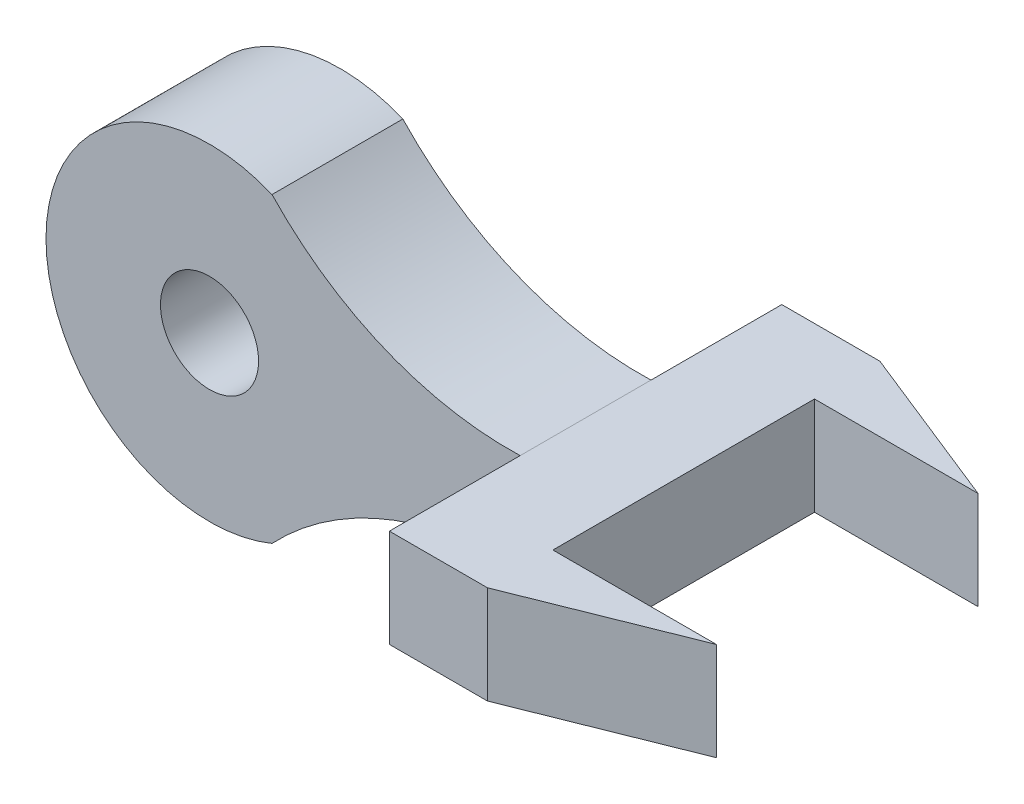
ISO-10303-21;
HEADER;
FILE_DESCRIPTION(('STEP AP214'),'2;1');
FILE_NAME('part.step','',(''),(''),'','','');
FILE_SCHEMA(('AUTOMOTIVE_DESIGN { 1 0 10303 214 1 1 1 1 }'));
ENDSEC;
DATA;
#1=APPLICATION_CONTEXT('core data for automotive mechanical design processes');
#2=APPLICATION_PROTOCOL_DEFINITION('international standard','automotive_design',2000,#1);
#3=PRODUCT_CONTEXT('',#1,'mechanical');
#4=PRODUCT('Part','Part','',(#3));
#5=PRODUCT_RELATED_PRODUCT_CATEGORY('part','',(#4));
#6=PRODUCT_DEFINITION_FORMATION('','',#4);
#7=PRODUCT_DEFINITION_CONTEXT('part definition',#1,'design');
#8=PRODUCT_DEFINITION('design','',#6,#7);
#9=PRODUCT_DEFINITION_SHAPE('','',#8);
#10=(LENGTH_UNIT() NAMED_UNIT(*) SI_UNIT(.MILLI.,.METRE.));
#11=(NAMED_UNIT(*) PLANE_ANGLE_UNIT() SI_UNIT($,.RADIAN.));
#12=(NAMED_UNIT(*) SI_UNIT($,.STERADIAN.) SOLID_ANGLE_UNIT());
#13=UNCERTAINTY_MEASURE_WITH_UNIT(LENGTH_MEASURE(1.E-05),#10,'distance_accuracy_value','');
#14=(GEOMETRIC_REPRESENTATION_CONTEXT(3) GLOBAL_UNCERTAINTY_ASSIGNED_CONTEXT((#13)) GLOBAL_UNIT_ASSIGNED_CONTEXT((#10,
#11,#12)) REPRESENTATION_CONTEXT('',''));
#15=CARTESIAN_POINT('',(0.,0.,0.));
#16=DIRECTION('',(0.,0.,1.));
#17=DIRECTION('',(1.,0.,0.));
#18=AXIS2_PLACEMENT_3D('',#15,#16,#17);
#19=CARTESIAN_POINT('',(91.7262942344475,-114.960943200018,20.));
#20=DIRECTION('',(0.,0.,-1.));
#21=DIRECTION('',(-1.,0.,0.));
#22=AXIS2_PLACEMENT_3D('',#19,#20,#21);
#23=PLANE('',#22);
#24=CARTESIAN_POINT('',(-2.22044604925031E-13,0.,20.));
#25=DIRECTION('',(0.,0.,1.));
#26=DIRECTION('',(1.,0.,0.));
#27=AXIS2_PLACEMENT_3D('',#24,#25,#26);
#28=CIRCLE('',#27,15.);
#29=CARTESIAN_POINT('',(14.9999999999998,0.,20.));
#30=VERTEX_POINT('',#29);
#31=EDGE_CURVE('E204',#30,#30,#28,.T.);
#32=ORIENTED_EDGE('',*,*,#31,.F.);
#33=EDGE_LOOP('',(#32));
#34=FACE_BOUND('',#33,.T.);
#35=DIRECTION('',(0.,-1.,0.));
#36=VECTOR('',#35,1.);
#37=CARTESIAN_POINT('',(94.9999999999995,-114.960943200018,20.));
#38=LINE('',#37,#36);
#39=CARTESIAN_POINT('',(95.,15.,20.));
#40=VERTEX_POINT('',#39);
#41=CARTESIAN_POINT('',(94.9999999999997,-15.,20.0000000000002));
#42=VERTEX_POINT('',#41);
#43=EDGE_CURVE('E201',#40,#42,#38,.T.);
#44=ORIENTED_EDGE('',*,*,#43,.F.);
#45=CARTESIAN_POINT('',(91.7396505637635,114.946836475967,20.0000000000002));
#46=DIRECTION('',(0.,0.,-1.));
#47=DIRECTION('',(1.,0.,0.));
#48=AXIS2_PLACEMENT_3D('',#45,#46,#47);
#49=CIRCLE('',#48,100.);
#50=CARTESIAN_POINT('',(19.1173128101043,46.2009561688995,20.0000000000002));
#51=VERTEX_POINT('',#50);
#52=EDGE_CURVE('E210',#40,#51,#49,.T.);
#53=ORIENTED_EDGE('',*,*,#52,.T.);
#54=CARTESIAN_POINT('',(-2.22044604925031E-13,0.,20.));
#55=DIRECTION('',(0.,0.,1.));
#56=DIRECTION('',(1.,0.,0.));
#57=AXIS2_PLACEMENT_3D('',#54,#55,#56);
#58=CIRCLE('',#57,50.);
#59=CARTESIAN_POINT('',(19.1173128101054,-46.2009561688994,20.));
#60=VERTEX_POINT('',#59);
#61=EDGE_CURVE('E212',#51,#60,#58,.T.);
#62=ORIENTED_EDGE('',*,*,#61,.T.);
#63=CARTESIAN_POINT('',(91.7262942344475,-114.960943200018,20.));
#64=DIRECTION('',(0.,0.,-1.));
#65=DIRECTION('',(-1.,0.,0.));
#66=AXIS2_PLACEMENT_3D('',#63,#64,#65);
#67=CIRCLE('',#66,100.);
#68=CARTESIAN_POINT('',(94.5209023577478,-14.9999999999999,20.));
#69=VERTEX_POINT('',#68);
#70=EDGE_CURVE('E215',#60,#69,#67,.T.);
#71=ORIENTED_EDGE('',*,*,#70,.T.);
#72=DIRECTION('',(1.,0.,0.));
#73=VECTOR('',#72,1.);
#74=CARTESIAN_POINT('',(94.5209023577478,-14.9999999999999,20.));
#75=LINE('',#74,#73);
#76=EDGE_CURVE('E57',#69,#42,#75,.T.);
#77=ORIENTED_EDGE('',*,*,#76,.T.);
#78=EDGE_LOOP('',(#44,#53,#62,#71,#77));
#79=FACE_BOUND('',#78,.T.);
#80=ADVANCED_FACE('F36',(#34,#79),#23,.F.);
#81=CARTESIAN_POINT('',(91.7262942344479,-114.960943200018,-20.));
#82=DIRECTION('',(0.,0.,-1.));
#83=DIRECTION('',(-1.,0.,0.));
#84=AXIS2_PLACEMENT_3D('',#81,#82,#83);
#85=PLANE('',#84);
#86=CARTESIAN_POINT('',(0.,0.,-19.9999999999999));
#87=DIRECTION('',(0.,0.,1.));
#88=DIRECTION('',(1.,0.,0.));
#89=AXIS2_PLACEMENT_3D('',#86,#87,#88);
#90=CIRCLE('',#89,15.);
#91=CARTESIAN_POINT('',(15.,0.,-19.9999999999999));
#92=VERTEX_POINT('',#91);
#93=EDGE_CURVE('E203',#92,#92,#90,.T.);
#94=ORIENTED_EDGE('',*,*,#93,.T.);
#95=EDGE_LOOP('',(#94));
#96=FACE_BOUND('',#95,.T.);
#97=CARTESIAN_POINT('',(91.739650563764,114.946836475967,-20.));
#98=DIRECTION('',(0.,0.,-1.));
#99=DIRECTION('',(1.,0.,0.));
#100=AXIS2_PLACEMENT_3D('',#97,#98,#99);
#101=CIRCLE('',#100,100.);
#102=CARTESIAN_POINT('',(94.9999999999997,15.,-20.));
#103=VERTEX_POINT('',#102);
#104=CARTESIAN_POINT('',(19.1173128101054,46.2009561688996,-20.));
#105=VERTEX_POINT('',#104);
#106=EDGE_CURVE('E207',#103,#105,#101,.T.);
#107=ORIENTED_EDGE('',*,*,#106,.F.);
#108=DIRECTION('',(0.,-1.,0.));
#109=VECTOR('',#108,1.);
#110=CARTESIAN_POINT('',(95.,-114.960943200018,-19.9999999999999));
#111=LINE('',#110,#109);
#112=CARTESIAN_POINT('',(95.,-15.,-19.9999999999999));
#113=VERTEX_POINT('',#112);
#114=EDGE_CURVE('E198',#103,#113,#111,.T.);
#115=ORIENTED_EDGE('',*,*,#114,.T.);
#116=DIRECTION('',(1.,0.,0.));
#117=VECTOR('',#116,1.);
#118=CARTESIAN_POINT('',(94.5209023577478,-14.9999999999999,-20.));
#119=LINE('',#118,#117);
#120=CARTESIAN_POINT('',(94.5209023577478,-14.9999999999999,-20.));
#121=VERTEX_POINT('',#120);
#122=EDGE_CURVE('E213',#121,#113,#119,.T.);
#123=ORIENTED_EDGE('',*,*,#122,.F.);
#124=CARTESIAN_POINT('',(91.7262942344479,-114.960943200018,-20.));
#125=DIRECTION('',(0.,0.,-1.));
#126=DIRECTION('',(-1.,0.,0.));
#127=AXIS2_PLACEMENT_3D('',#124,#125,#126);
#128=CIRCLE('',#127,100.);
#129=CARTESIAN_POINT('',(19.1173128101056,-46.2009561688995,-20.));
#130=VERTEX_POINT('',#129);
#131=EDGE_CURVE('E222',#130,#121,#128,.T.);
#132=ORIENTED_EDGE('',*,*,#131,.F.);
#133=CARTESIAN_POINT('',(0.,0.,-19.9999999999999));
#134=DIRECTION('',(0.,0.,1.));
#135=DIRECTION('',(1.,0.,0.));
#136=AXIS2_PLACEMENT_3D('',#133,#134,#135);
#137=CIRCLE('',#136,50.);
#138=EDGE_CURVE('E220',#105,#130,#137,.T.);
#139=ORIENTED_EDGE('',*,*,#138,.F.);
#140=EDGE_LOOP('',(#107,#115,#123,#132,#139));
#141=FACE_BOUND('',#140,.T.);
#142=ADVANCED_FACE('F245',(#96,#141),#85,.T.);
#143=CARTESIAN_POINT('',(125.,15.0000000000001,20.));
#144=DIRECTION('',(-1.,0.,0.));
#145=DIRECTION('',(0.,0.,1.));
#146=AXIS2_PLACEMENT_3D('',#143,#144,#145);
#147=PLANE('',#146);
#148=DIRECTION('',(0.,0.,-1.));
#149=VECTOR('',#148,1.);
#150=CARTESIAN_POINT('',(125.,15.0000000000001,20.));
#151=LINE('',#150,#149);
#152=CARTESIAN_POINT('',(125.,15.,40.0000000000002));
#153=VERTEX_POINT('',#152);
#154=CARTESIAN_POINT('',(125.,15.0000000000001,-40.));
#155=VERTEX_POINT('',#154);
#156=EDGE_CURVE('E11',#153,#155,#151,.T.);
#157=ORIENTED_EDGE('',*,*,#156,.F.);
#158=DIRECTION('',(0.,1.,0.));
#159=VECTOR('',#158,1.);
#160=CARTESIAN_POINT('',(125.,-68.8516480713451,40.0000000000002));
#161=LINE('',#160,#159);
#162=CARTESIAN_POINT('',(125.,-15.,40.));
#163=VERTEX_POINT('',#162);
#164=EDGE_CURVE('E140',#163,#153,#161,.T.);
#165=ORIENTED_EDGE('',*,*,#164,.F.);
#166=DIRECTION('',(0.,0.,-1.));
#167=VECTOR('',#166,1.);
#168=CARTESIAN_POINT('',(125.,-15.,20.));
#169=LINE('',#168,#167);
#170=CARTESIAN_POINT('',(125.,-15.,-40.));
#171=VERTEX_POINT('',#170);
#172=EDGE_CURVE('E218',#163,#171,#169,.T.);
#173=ORIENTED_EDGE('',*,*,#172,.T.);
#174=DIRECTION('',(0.,1.,0.));
#175=VECTOR('',#174,1.);
#176=CARTESIAN_POINT('',(125.,-68.851648071345,-40.));
#177=LINE('',#176,#175);
#178=EDGE_CURVE('E165',#171,#155,#177,.T.);
#179=ORIENTED_EDGE('',*,*,#178,.T.);
#180=EDGE_LOOP('',(#157,#165,#173,#179));
#181=FACE_BOUND('',#180,.T.);
#182=ADVANCED_FACE('F38',(#181),#147,.F.);
#183=CARTESIAN_POINT('',(95.,15.,20.));
#184=DIRECTION('',(0.,-1.,0.));
#185=DIRECTION('',(0.,0.,-1.));
#186=AXIS2_PLACEMENT_3D('',#183,#184,#185);
#187=PLANE('',#186);
#188=DIRECTION('',(-1.,0.,0.));
#189=VECTOR('',#188,1.);
#190=CARTESIAN_POINT('',(125.,15.0000000000001,60.0000000000002));
#191=LINE('',#190,#189);
#192=CARTESIAN_POINT('',(125.,15.0000000000001,60.0000000000002));
#193=VERTEX_POINT('',#192);
#194=CARTESIAN_POINT('',(95.,14.9999999999999,60.));
#195=VERTEX_POINT('',#194);
#196=EDGE_CURVE('E145',#193,#195,#191,.T.);
#197=ORIENTED_EDGE('',*,*,#196,.F.);
#198=DIRECTION('',(0.92847669088526,0.,-0.371390676354103));
#199=VECTOR('',#198,1.);
#200=CARTESIAN_POINT('',(125.,15.0000000000001,60.0000000000002));
#201=LINE('',#200,#199);
#202=CARTESIAN_POINT('',(175.,15.,40.));
#203=VERTEX_POINT('',#202);
#204=EDGE_CURVE('E135',#193,#203,#201,.T.);
#205=ORIENTED_EDGE('',*,*,#204,.T.);
#206=DIRECTION('',(-1.,0.,0.));
#207=VECTOR('',#206,1.);
#208=CARTESIAN_POINT('',(175.,15.,40.));
#209=LINE('',#208,#207);
#210=EDGE_CURVE('E141',#203,#153,#209,.T.);
#211=ORIENTED_EDGE('',*,*,#210,.T.);
#212=ORIENTED_EDGE('',*,*,#156,.T.);
#213=DIRECTION('',(1.,0.,0.));
#214=VECTOR('',#213,1.);
#215=CARTESIAN_POINT('',(175.,15.0000000000001,-40.));
#216=LINE('',#215,#214);
#217=CARTESIAN_POINT('',(175.,15.0000000000001,-40.));
#218=VERTEX_POINT('',#217);
#219=EDGE_CURVE('E156',#155,#218,#216,.T.);
#220=ORIENTED_EDGE('',*,*,#219,.T.);
#221=DIRECTION('',(-0.92847669088526,0.,-0.371390676354104));
#222=VECTOR('',#221,1.);
#223=CARTESIAN_POINT('',(125.,15.0000000000001,-59.9999999999999));
#224=LINE('',#223,#222);
#225=CARTESIAN_POINT('',(125.,15.0000000000001,-59.9999999999999));
#226=VERTEX_POINT('',#225);
#227=EDGE_CURVE('E162',#218,#226,#224,.T.);
#228=ORIENTED_EDGE('',*,*,#227,.T.);
#229=DIRECTION('',(-1.,0.,0.));
#230=VECTOR('',#229,1.);
#231=CARTESIAN_POINT('',(125.,15.0000000000001,-59.9999999999999));
#232=LINE('',#231,#230);
#233=CARTESIAN_POINT('',(94.9999999999997,14.9999999999999,-60.));
#234=VERTEX_POINT('',#233);
#235=EDGE_CURVE('E183',#226,#234,#232,.T.);
#236=ORIENTED_EDGE('',*,*,#235,.T.);
#237=DIRECTION('',(0.,0.,-1.));
#238=VECTOR('',#237,1.);
#239=CARTESIAN_POINT('',(95.,14.9999999999999,60.));
#240=LINE('',#239,#238);
#241=EDGE_CURVE('E194',#103,#234,#240,.T.);
#242=ORIENTED_EDGE('',*,*,#241,.F.);
#243=DIRECTION('',(0.,0.,-1.));
#244=VECTOR('',#243,1.);
#245=CARTESIAN_POINT('',(95.,15.,20.));
#246=LINE('',#245,#244);
#247=EDGE_CURVE('E44',#40,#103,#246,.T.);
#248=ORIENTED_EDGE('',*,*,#247,.F.);
#249=EDGE_CURVE('E195',#195,#40,#240,.T.);
#250=ORIENTED_EDGE('',*,*,#249,.F.);
#251=EDGE_LOOP('',(#197,#205,#211,#212,#220,#228,#236,#242,#248,#250));
#252=FACE_BOUND('',#251,.T.);
#253=ADVANCED_FACE('F143',(#252),#187,.F.);
#254=CARTESIAN_POINT('',(91.7396505637635,114.946836475967,20.0000000000002));
#255=DIRECTION('',(0.,0.,-1.));
#256=DIRECTION('',(-1.,0.,0.));
#257=AXIS2_PLACEMENT_3D('',#254,#255,#256);
#258=CYLINDRICAL_SURFACE('',#257,100.);
#259=ORIENTED_EDGE('',*,*,#106,.T.);
#260=DIRECTION('',(0.,0.,-1.));
#261=VECTOR('',#260,1.);
#262=CARTESIAN_POINT('',(19.1173128101043,46.2009561688995,20.0000000000002));
#263=LINE('',#262,#261);
#264=EDGE_CURVE('E233',#51,#105,#263,.T.);
#265=ORIENTED_EDGE('',*,*,#264,.F.);
#266=ORIENTED_EDGE('',*,*,#52,.F.);
#267=ORIENTED_EDGE('',*,*,#247,.T.);
#268=EDGE_LOOP('',(#259,#265,#266,#267));
#269=FACE_BOUND('',#268,.T.);
#270=ADVANCED_FACE('F240',(#269),#258,.F.);
#271=CARTESIAN_POINT('',(-2.22044604925031E-13,0.,20.));
#272=DIRECTION('',(0.,0.,-1.));
#273=DIRECTION('',(-1.,0.,0.));
#274=AXIS2_PLACEMENT_3D('',#271,#272,#273);
#275=CYLINDRICAL_SURFACE('',#274,50.);
#276=ORIENTED_EDGE('',*,*,#138,.T.);
#277=DIRECTION('',(0.,0.,-1.));
#278=VECTOR('',#277,1.);
#279=CARTESIAN_POINT('',(19.1173128101054,-46.2009561688994,20.));
#280=LINE('',#279,#278);
#281=EDGE_CURVE('E230',#60,#130,#280,.T.);
#282=ORIENTED_EDGE('',*,*,#281,.F.);
#283=ORIENTED_EDGE('',*,*,#61,.F.);
#284=ORIENTED_EDGE('',*,*,#264,.T.);
#285=EDGE_LOOP('',(#276,#282,#283,#284));
#286=FACE_BOUND('',#285,.T.);
#287=ADVANCED_FACE('F250',(#286),#275,.T.);
#288=CARTESIAN_POINT('',(91.7262942344475,-114.960943200018,20.));
#289=DIRECTION('',(0.,0.,-1.));
#290=DIRECTION('',(-1.,0.,0.));
#291=AXIS2_PLACEMENT_3D('',#288,#289,#290);
#292=CYLINDRICAL_SURFACE('',#291,100.);
#293=ORIENTED_EDGE('',*,*,#131,.T.);
#294=DIRECTION('',(0.,0.,-1.));
#295=VECTOR('',#294,1.);
#296=CARTESIAN_POINT('',(94.5209023577478,-14.9999999999999,20.));
#297=LINE('',#296,#295);
#298=EDGE_CURVE('E227',#69,#121,#297,.T.);
#299=ORIENTED_EDGE('',*,*,#298,.F.);
#300=ORIENTED_EDGE('',*,*,#70,.F.);
#301=ORIENTED_EDGE('',*,*,#281,.T.);
#302=EDGE_LOOP('',(#293,#299,#300,#301));
#303=FACE_BOUND('',#302,.T.);
#304=ADVANCED_FACE('F254',(#303),#292,.F.);
#305=CARTESIAN_POINT('',(94.5209023577478,-14.9999999999999,20.));
#306=DIRECTION('',(0.,1.,0.));
#307=DIRECTION('',(0.,0.,1.));
#308=AXIS2_PLACEMENT_3D('',#305,#306,#307);
#309=PLANE('',#308);
#310=ORIENTED_EDGE('',*,*,#172,.F.);
#311=DIRECTION('',(1.,0.,0.));
#312=VECTOR('',#311,1.);
#313=CARTESIAN_POINT('',(175.,-15.0000000000002,40.0000000000003));
#314=LINE('',#313,#312);
#315=CARTESIAN_POINT('',(175.,-15.0000000000002,40.0000000000003));
#316=VERTEX_POINT('',#315);
#317=EDGE_CURVE('E153',#163,#316,#314,.T.);
#318=ORIENTED_EDGE('',*,*,#317,.T.);
#319=DIRECTION('',(-0.92847669088526,0.,0.371390676354104));
#320=VECTOR('',#319,1.);
#321=CARTESIAN_POINT('',(125.,-15.,60.));
#322=LINE('',#321,#320);
#323=CARTESIAN_POINT('',(125.,-15.,60.));
#324=VERTEX_POINT('',#323);
#325=EDGE_CURVE('E137',#316,#324,#322,.T.);
#326=ORIENTED_EDGE('',*,*,#325,.T.);
#327=DIRECTION('',(1.,0.,0.));
#328=VECTOR('',#327,1.);
#329=CARTESIAN_POINT('',(125.,-15.,60.));
#330=LINE('',#329,#328);
#331=CARTESIAN_POINT('',(94.9999999999993,-15.0000000000001,60.0000000000002));
#332=VERTEX_POINT('',#331);
#333=EDGE_CURVE('E178',#332,#324,#330,.T.);
#334=ORIENTED_EDGE('',*,*,#333,.F.);
#335=DIRECTION('',(0.,0.,-1.));
#336=VECTOR('',#335,1.);
#337=CARTESIAN_POINT('',(94.9999999999993,-15.0000000000001,60.0000000000002));
#338=LINE('',#337,#336);
#339=EDGE_CURVE('E191',#332,#42,#338,.T.);
#340=ORIENTED_EDGE('',*,*,#339,.T.);
#341=ORIENTED_EDGE('',*,*,#76,.F.);
#342=ORIENTED_EDGE('',*,*,#298,.T.);
#343=ORIENTED_EDGE('',*,*,#122,.T.);
#344=CARTESIAN_POINT('',(95.0000000000002,-15.,-60.));
#345=VERTEX_POINT('',#344);
#346=EDGE_CURVE('E181',#113,#345,#338,.T.);
#347=ORIENTED_EDGE('',*,*,#346,.T.);
#348=DIRECTION('',(1.,0.,0.));
#349=VECTOR('',#348,1.);
#350=CARTESIAN_POINT('',(125.,-14.9999999999999,-59.9999999999998));
#351=LINE('',#350,#349);
#352=CARTESIAN_POINT('',(125.,-14.9999999999999,-59.9999999999998));
#353=VERTEX_POINT('',#352);
#354=EDGE_CURVE('E174',#345,#353,#351,.T.);
#355=ORIENTED_EDGE('',*,*,#354,.T.);
#356=DIRECTION('',(0.928476690885261,0.,0.371390676354104));
#357=VECTOR('',#356,1.);
#358=CARTESIAN_POINT('',(125.,-14.9999999999999,-59.9999999999998));
#359=LINE('',#358,#357);
#360=CARTESIAN_POINT('',(175.,-15.,-40.));
#361=VERTEX_POINT('',#360);
#362=EDGE_CURVE('E157',#353,#361,#359,.T.);
#363=ORIENTED_EDGE('',*,*,#362,.T.);
#364=DIRECTION('',(-1.,0.,0.));
#365=VECTOR('',#364,1.);
#366=CARTESIAN_POINT('',(175.,-15.,-40.));
#367=LINE('',#366,#365);
#368=EDGE_CURVE('E159',#361,#171,#367,.T.);
#369=ORIENTED_EDGE('',*,*,#368,.T.);
#370=EDGE_LOOP('',(#310,#318,#326,#334,#340,#341,#342,#343,#347,#355,#363,#369));
#371=FACE_BOUND('',#370,.T.);
#372=ADVANCED_FACE('F263',(#371),#309,.F.);
#373=CARTESIAN_POINT('',(-2.22044604925031E-13,0.,20.));
#374=DIRECTION('',(0.,0.,-1.));
#375=DIRECTION('',(-1.,0.,0.));
#376=AXIS2_PLACEMENT_3D('',#373,#374,#375);
#377=CYLINDRICAL_SURFACE('',#376,15.);
#378=ORIENTED_EDGE('',*,*,#31,.T.);
#379=EDGE_LOOP('',(#378));
#380=FACE_BOUND('',#379,.T.);
#381=ORIENTED_EDGE('',*,*,#93,.F.);
#382=EDGE_LOOP('',(#381));
#383=FACE_BOUND('',#382,.T.);
#384=ADVANCED_FACE('F290',(#380,#383),#377,.F.);
#385=CARTESIAN_POINT('',(0.,0.,-59.9999999999999));
#386=DIRECTION('',(0.,0.,1.));
#387=DIRECTION('',(1.,0.,0.));
#388=AXIS2_PLACEMENT_3D('',#385,#386,#387);
#389=PLANE('',#388);
#390=DIRECTION('',(0.,1.,0.));
#391=VECTOR('',#390,1.);
#392=CARTESIAN_POINT('',(125.,-14.9999999999999,-59.9999999999998));
#393=LINE('',#392,#391);
#394=EDGE_CURVE('E171',#353,#226,#393,.T.);
#395=ORIENTED_EDGE('',*,*,#394,.F.);
#396=ORIENTED_EDGE('',*,*,#354,.F.);
#397=DIRECTION('',(0.,-1.,0.));
#398=VECTOR('',#397,1.);
#399=CARTESIAN_POINT('',(95.0000000000002,-15.,-60.));
#400=LINE('',#399,#398);
#401=EDGE_CURVE('E186',#234,#345,#400,.T.);
#402=ORIENTED_EDGE('',*,*,#401,.F.);
#403=ORIENTED_EDGE('',*,*,#235,.F.);
#404=EDGE_LOOP('',(#395,#396,#402,#403));
#405=FACE_BOUND('',#404,.T.);
#406=ADVANCED_FACE('F315',(#405),#389,.F.);
#407=CARTESIAN_POINT('',(94.9999999999993,-15.0000000000001,60.0000000000002));
#408=DIRECTION('',(1.,0.,0.));
#409=DIRECTION('',(0.,0.,-1.));
#410=AXIS2_PLACEMENT_3D('',#407,#408,#409);
#411=PLANE('',#410);
#412=ORIENTED_EDGE('',*,*,#114,.F.);
#413=ORIENTED_EDGE('',*,*,#241,.T.);
#414=ORIENTED_EDGE('',*,*,#401,.T.);
#415=ORIENTED_EDGE('',*,*,#346,.F.);
#416=EDGE_LOOP('',(#412,#413,#414,#415));
#417=FACE_BOUND('',#416,.T.);
#418=ADVANCED_FACE('F276',(#417),#411,.F.);
#419=ORIENTED_EDGE('',*,*,#249,.T.);
#420=ORIENTED_EDGE('',*,*,#43,.T.);
#421=ORIENTED_EDGE('',*,*,#339,.F.);
#422=DIRECTION('',(0.,-1.,0.));
#423=VECTOR('',#422,1.);
#424=CARTESIAN_POINT('',(94.9999999999993,-15.0000000000001,60.0000000000002));
#425=LINE('',#424,#423);
#426=EDGE_CURVE('E176',#195,#332,#425,.T.);
#427=ORIENTED_EDGE('',*,*,#426,.F.);
#428=EDGE_LOOP('',(#419,#420,#421,#427));
#429=FACE_BOUND('',#428,.T.);
#430=ADVANCED_FACE('F258',(#429),#411,.F.);
#431=CARTESIAN_POINT('',(0.,0.,60.0000000000002));
#432=DIRECTION('',(0.,0.,1.));
#433=DIRECTION('',(1.,0.,0.));
#434=AXIS2_PLACEMENT_3D('',#431,#432,#433);
#435=PLANE('',#434);
#436=DIRECTION('',(0.,1.,0.));
#437=VECTOR('',#436,1.);
#438=CARTESIAN_POINT('',(125.,-15.,60.));
#439=LINE('',#438,#437);
#440=EDGE_CURVE('E172',#324,#193,#439,.T.);
#441=ORIENTED_EDGE('',*,*,#440,.T.);
#442=ORIENTED_EDGE('',*,*,#196,.T.);
#443=ORIENTED_EDGE('',*,*,#426,.T.);
#444=ORIENTED_EDGE('',*,*,#333,.T.);
#445=EDGE_LOOP('',(#441,#442,#443,#444));
#446=FACE_BOUND('',#445,.T.);
#447=ADVANCED_FACE('F265',(#446),#435,.T.);
#448=CARTESIAN_POINT('',(124.999999999999,-68.8516480713453,-60.));
#449=DIRECTION('',(0.371390676354104,0.,-0.92847669088526));
#450=DIRECTION('',(-0.928476690885261,0.,-0.371390676354104));
#451=AXIS2_PLACEMENT_3D('',#448,#449,#450);
#452=PLANE('',#451);
#453=ORIENTED_EDGE('',*,*,#362,.F.);
#454=ORIENTED_EDGE('',*,*,#394,.T.);
#455=ORIENTED_EDGE('',*,*,#227,.F.);
#456=DIRECTION('',(0.,1.,0.));
#457=VECTOR('',#456,1.);
#458=CARTESIAN_POINT('',(175.,-68.8516480713453,-40.));
#459=LINE('',#458,#457);
#460=EDGE_CURVE('E160',#361,#218,#459,.T.);
#461=ORIENTED_EDGE('',*,*,#460,.F.);
#462=EDGE_LOOP('',(#453,#454,#455,#461));
#463=FACE_BOUND('',#462,.T.);
#464=ADVANCED_FACE('F267',(#463),#452,.T.);
#465=CARTESIAN_POINT('',(175.,-68.8516480713453,-40.));
#466=DIRECTION('',(0.,0.,1.));
#467=DIRECTION('',(1.,0.,0.));
#468=AXIS2_PLACEMENT_3D('',#465,#466,#467);
#469=PLANE('',#468);
#470=ORIENTED_EDGE('',*,*,#368,.F.);
#471=ORIENTED_EDGE('',*,*,#460,.T.);
#472=ORIENTED_EDGE('',*,*,#219,.F.);
#473=ORIENTED_EDGE('',*,*,#178,.F.);
#474=EDGE_LOOP('',(#470,#471,#472,#473));
#475=FACE_BOUND('',#474,.T.);
#476=ADVANCED_FACE('F273',(#475),#469,.T.);
#477=CARTESIAN_POINT('',(175.,-68.8516480713451,40.0000000000002));
#478=DIRECTION('',(0.,0.,-1.));
#479=DIRECTION('',(-1.,0.,0.));
#480=AXIS2_PLACEMENT_3D('',#477,#478,#479);
#481=PLANE('',#480);
#482=ORIENTED_EDGE('',*,*,#317,.F.);
#483=ORIENTED_EDGE('',*,*,#164,.T.);
#484=ORIENTED_EDGE('',*,*,#210,.F.);
#485=DIRECTION('',(0.,1.,0.));
#486=VECTOR('',#485,1.);
#487=CARTESIAN_POINT('',(175.,-68.8516480713451,40.0000000000002));
#488=LINE('',#487,#486);
#489=EDGE_CURVE('E131',#316,#203,#488,.T.);
#490=ORIENTED_EDGE('',*,*,#489,.F.);
#491=EDGE_LOOP('',(#482,#483,#484,#490));
#492=FACE_BOUND('',#491,.T.);
#493=ADVANCED_FACE('F148',(#492),#481,.T.);
#494=CARTESIAN_POINT('',(125.,-68.851648071345,60.0000000000002));
#495=DIRECTION('',(0.371390676354104,0.,0.92847669088526));
#496=DIRECTION('',(0.92847669088526,0.,-0.371390676354104));
#497=AXIS2_PLACEMENT_3D('',#494,#495,#496);
#498=PLANE('',#497);
#499=ORIENTED_EDGE('',*,*,#325,.F.);
#500=ORIENTED_EDGE('',*,*,#489,.T.);
#501=ORIENTED_EDGE('',*,*,#204,.F.);
#502=ORIENTED_EDGE('',*,*,#440,.F.);
#503=EDGE_LOOP('',(#499,#500,#501,#502));
#504=FACE_BOUND('',#503,.T.);
#505=ADVANCED_FACE('F133',(#504),#498,.T.);
#506=CLOSED_SHELL('',(#80,#142,#182,#253,#270,#287,#304,#372,#384,#406,#418,#430,#447,#464,#476,
#493,#505));
#507=MANIFOLD_SOLID_BREP('B2',#506);
#508=ADVANCED_BREP_SHAPE_REPRESENTATION('',(#18,#507),#14);
#509=SHAPE_DEFINITION_REPRESENTATION(#9,#508);
ENDSEC;
END-ISO-10303-21;
